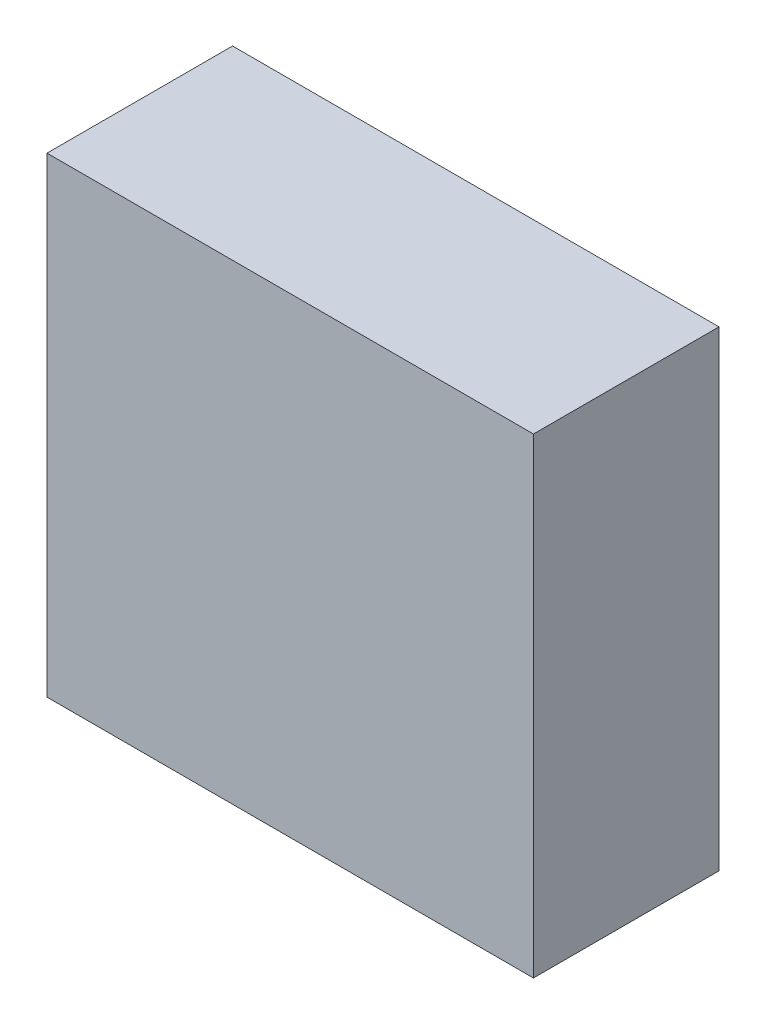
ISO-10303-21;
HEADER;
FILE_DESCRIPTION(('STEP AP214'),'2;1');
FILE_NAME('part.step','',(''),(''),'','','');
FILE_SCHEMA(('AUTOMOTIVE_DESIGN { 1 0 10303 214 1 1 1 1 }'));
ENDSEC;
DATA;
#1=APPLICATION_CONTEXT('core data for automotive mechanical design processes');
#2=APPLICATION_PROTOCOL_DEFINITION('international standard','automotive_design',2000,#1);
#3=PRODUCT_CONTEXT('',#1,'mechanical');
#4=PRODUCT('Part','Part','',(#3));
#5=PRODUCT_RELATED_PRODUCT_CATEGORY('part','',(#4));
#6=PRODUCT_DEFINITION_FORMATION('','',#4);
#7=PRODUCT_DEFINITION_CONTEXT('part definition',#1,'design');
#8=PRODUCT_DEFINITION('design','',#6,#7);
#9=PRODUCT_DEFINITION_SHAPE('','',#8);
#10=(LENGTH_UNIT() NAMED_UNIT(*) SI_UNIT(.MILLI.,.METRE.));
#11=(NAMED_UNIT(*) PLANE_ANGLE_UNIT() SI_UNIT($,.RADIAN.));
#12=(NAMED_UNIT(*) SI_UNIT($,.STERADIAN.) SOLID_ANGLE_UNIT());
#13=UNCERTAINTY_MEASURE_WITH_UNIT(LENGTH_MEASURE(1.E-05),#10,'distance_accuracy_value','');
#14=(GEOMETRIC_REPRESENTATION_CONTEXT(3) GLOBAL_UNCERTAINTY_ASSIGNED_CONTEXT((#13)) GLOBAL_UNIT_ASSIGNED_CONTEXT((#10,
#11,#12)) REPRESENTATION_CONTEXT('',''));
#15=CARTESIAN_POINT('',(0.,0.,0.));
#16=DIRECTION('',(0.,0.,1.));
#17=DIRECTION('',(1.,0.,0.));
#18=AXIS2_PLACEMENT_3D('',#15,#16,#17);
#19=CARTESIAN_POINT('',(-26.2141067035019,0.,10.));
#20=DIRECTION('',(1.,0.,0.));
#21=DIRECTION('',(0.,0.,-1.));
#22=AXIS2_PLACEMENT_3D('',#19,#20,#21);
#23=PLANE('',#22);
#24=DIRECTION('',(0.,-1.,0.));
#25=VECTOR('',#24,1.);
#26=CARTESIAN_POINT('',(-26.2141067035019,0.,0.));
#27=LINE('',#26,#25);
#28=CARTESIAN_POINT('',(-26.2141067035019,25.389255499154,0.));
#29=VERTEX_POINT('',#28);
#30=CARTESIAN_POINT('',(-26.2141067035019,0.,0.));
#31=VERTEX_POINT('',#30);
#32=EDGE_CURVE('E96',#29,#31,#27,.T.);
#33=ORIENTED_EDGE('',*,*,#32,.T.);
#34=DIRECTION('',(0.,0.,-1.));
#35=VECTOR('',#34,1.);
#36=CARTESIAN_POINT('',(-26.2141067035019,0.,10.));
#37=LINE('',#36,#35);
#38=CARTESIAN_POINT('',(-26.2141067035019,0.,10.));
#39=VERTEX_POINT('',#38);
#40=EDGE_CURVE('E11',#39,#31,#37,.T.);
#41=ORIENTED_EDGE('',*,*,#40,.F.);
#42=DIRECTION('',(0.,-1.,0.));
#43=VECTOR('',#42,1.);
#44=CARTESIAN_POINT('',(-26.2141067035019,0.,10.));
#45=LINE('',#44,#43);
#46=CARTESIAN_POINT('',(-26.2141067035019,25.389255499154,10.));
#47=VERTEX_POINT('',#46);
#48=EDGE_CURVE('E84',#47,#39,#45,.T.);
#49=ORIENTED_EDGE('',*,*,#48,.F.);
#50=DIRECTION('',(0.,0.,-1.));
#51=VECTOR('',#50,1.);
#52=CARTESIAN_POINT('',(-26.2141067035019,25.389255499154,10.));
#53=LINE('',#52,#51);
#54=EDGE_CURVE('E92',#47,#29,#53,.T.);
#55=ORIENTED_EDGE('',*,*,#54,.T.);
#56=EDGE_LOOP('',(#33,#41,#49,#55));
#57=FACE_BOUND('',#56,.T.);
#58=ADVANCED_FACE('F33',(#57),#23,.F.);
#59=CARTESIAN_POINT('',(0.,0.,10.));
#60=DIRECTION('',(0.,1.,0.));
#61=DIRECTION('',(0.,0.,1.));
#62=AXIS2_PLACEMENT_3D('',#59,#60,#61);
#63=PLANE('',#62);
#64=DIRECTION('',(1.,0.,0.));
#65=VECTOR('',#64,1.);
#66=CARTESIAN_POINT('',(0.,0.,0.));
#67=LINE('',#66,#65);
#68=CARTESIAN_POINT('',(0.,0.,0.));
#69=VERTEX_POINT('',#68);
#70=EDGE_CURVE('E88',#31,#69,#67,.T.);
#71=ORIENTED_EDGE('',*,*,#70,.T.);
#72=DIRECTION('',(0.,0.,-1.));
#73=VECTOR('',#72,1.);
#74=CARTESIAN_POINT('',(0.,0.,10.));
#75=LINE('',#74,#73);
#76=CARTESIAN_POINT('',(0.,0.,10.));
#77=VERTEX_POINT('',#76);
#78=EDGE_CURVE('E41',#77,#69,#75,.T.);
#79=ORIENTED_EDGE('',*,*,#78,.F.);
#80=DIRECTION('',(1.,0.,0.));
#81=VECTOR('',#80,1.);
#82=CARTESIAN_POINT('',(0.,0.,10.));
#83=LINE('',#82,#81);
#84=EDGE_CURVE('E79',#39,#77,#83,.T.);
#85=ORIENTED_EDGE('',*,*,#84,.F.);
#86=ORIENTED_EDGE('',*,*,#40,.T.);
#87=EDGE_LOOP('',(#71,#79,#85,#86));
#88=FACE_BOUND('',#87,.T.);
#89=ADVANCED_FACE('F87',(#88),#63,.F.);
#90=CARTESIAN_POINT('',(0.,25.389255499154,10.));
#91=DIRECTION('',(-1.,0.,0.));
#92=DIRECTION('',(0.,0.,1.));
#93=AXIS2_PLACEMENT_3D('',#90,#91,#92);
#94=PLANE('',#93);
#95=DIRECTION('',(0.,1.,0.));
#96=VECTOR('',#95,1.);
#97=CARTESIAN_POINT('',(0.,25.389255499154,0.));
#98=LINE('',#97,#96);
#99=CARTESIAN_POINT('',(0.,25.389255499154,0.));
#100=VERTEX_POINT('',#99);
#101=EDGE_CURVE('E66',#69,#100,#98,.T.);
#102=ORIENTED_EDGE('',*,*,#101,.T.);
#103=DIRECTION('',(0.,0.,-1.));
#104=VECTOR('',#103,1.);
#105=CARTESIAN_POINT('',(0.,25.389255499154,10.));
#106=LINE('',#105,#104);
#107=CARTESIAN_POINT('',(0.,25.389255499154,10.));
#108=VERTEX_POINT('',#107);
#109=EDGE_CURVE('E89',#108,#100,#106,.T.);
#110=ORIENTED_EDGE('',*,*,#109,.F.);
#111=DIRECTION('',(0.,1.,0.));
#112=VECTOR('',#111,1.);
#113=CARTESIAN_POINT('',(0.,25.389255499154,10.));
#114=LINE('',#113,#112);
#115=EDGE_CURVE('E82',#77,#108,#114,.T.);
#116=ORIENTED_EDGE('',*,*,#115,.F.);
#117=ORIENTED_EDGE('',*,*,#78,.T.);
#118=EDGE_LOOP('',(#102,#110,#116,#117));
#119=FACE_BOUND('',#118,.T.);
#120=ADVANCED_FACE('F90',(#119),#94,.F.);
#121=CARTESIAN_POINT('',(-26.2141067035019,25.389255499154,10.));
#122=DIRECTION('',(0.,-1.,0.));
#123=DIRECTION('',(0.,0.,-1.));
#124=AXIS2_PLACEMENT_3D('',#121,#122,#123);
#125=PLANE('',#124);
#126=DIRECTION('',(-1.,0.,0.));
#127=VECTOR('',#126,1.);
#128=CARTESIAN_POINT('',(-26.2141067035019,25.389255499154,0.));
#129=LINE('',#128,#127);
#130=EDGE_CURVE('E72',#100,#29,#129,.T.);
#131=ORIENTED_EDGE('',*,*,#130,.T.);
#132=ORIENTED_EDGE('',*,*,#54,.F.);
#133=DIRECTION('',(-1.,0.,0.));
#134=VECTOR('',#133,1.);
#135=CARTESIAN_POINT('',(-26.2141067035019,25.389255499154,10.));
#136=LINE('',#135,#134);
#137=EDGE_CURVE('E49',#108,#47,#136,.T.);
#138=ORIENTED_EDGE('',*,*,#137,.F.);
#139=ORIENTED_EDGE('',*,*,#109,.T.);
#140=EDGE_LOOP('',(#131,#132,#138,#139));
#141=FACE_BOUND('',#140,.T.);
#142=ADVANCED_FACE('F103',(#141),#125,.F.);
#143=CARTESIAN_POINT('',(0.,0.,10.));
#144=DIRECTION('',(0.,0.,-1.));
#145=DIRECTION('',(-1.,0.,0.));
#146=AXIS2_PLACEMENT_3D('',#143,#144,#145);
#147=PLANE('',#146);
#148=ORIENTED_EDGE('',*,*,#48,.T.);
#149=ORIENTED_EDGE('',*,*,#84,.T.);
#150=ORIENTED_EDGE('',*,*,#115,.T.);
#151=ORIENTED_EDGE('',*,*,#137,.T.);
#152=EDGE_LOOP('',(#148,#149,#150,#151));
#153=FACE_BOUND('',#152,.T.);
#154=ADVANCED_FACE('F80',(#153),#147,.F.);
#155=CARTESIAN_POINT('',(0.,0.,0.));
#156=DIRECTION('',(0.,0.,-1.));
#157=DIRECTION('',(-1.,0.,0.));
#158=AXIS2_PLACEMENT_3D('',#155,#156,#157);
#159=PLANE('',#158);
#160=ORIENTED_EDGE('',*,*,#32,.F.);
#161=ORIENTED_EDGE('',*,*,#130,.F.);
#162=ORIENTED_EDGE('',*,*,#101,.F.);
#163=ORIENTED_EDGE('',*,*,#70,.F.);
#164=EDGE_LOOP('',(#160,#161,#162,#163));
#165=FACE_BOUND('',#164,.T.);
#166=ADVANCED_FACE('F106',(#165),#159,.T.);
#167=CLOSED_SHELL('',(#58,#89,#120,#142,#154,#166));
#168=MANIFOLD_SOLID_BREP('B2',#167);
#169=ADVANCED_BREP_SHAPE_REPRESENTATION('',(#18,#168),#14);
#170=SHAPE_DEFINITION_REPRESENTATION(#9,#169);
ENDSEC;
END-ISO-10303-21;
